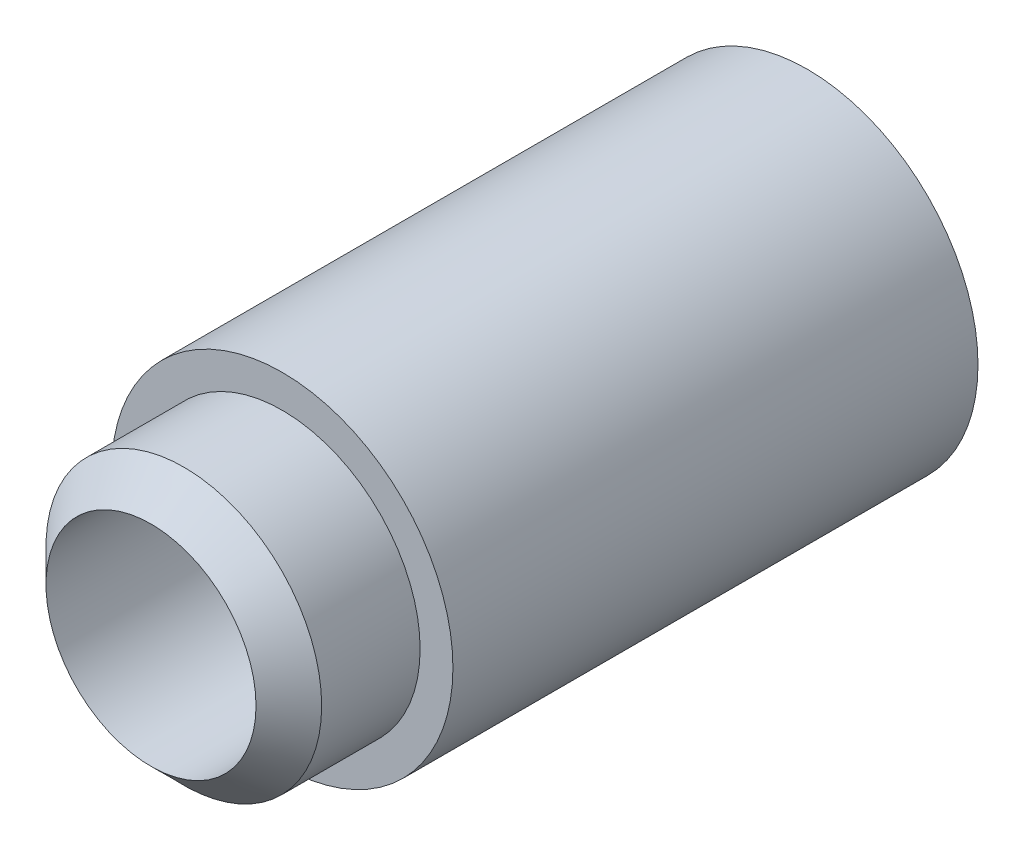
ISO-10303-21;
HEADER;
FILE_DESCRIPTION(('STEP AP214'),'2;1');
FILE_NAME('part.step','',(''),(''),'','','');
FILE_SCHEMA(('AUTOMOTIVE_DESIGN { 1 0 10303 214 1 1 1 1 }'));
ENDSEC;
DATA;
#1=APPLICATION_CONTEXT('core data for automotive mechanical design processes');
#2=APPLICATION_PROTOCOL_DEFINITION('international standard','automotive_design',2000,#1);
#3=PRODUCT_CONTEXT('',#1,'mechanical');
#4=PRODUCT('Part','Part','',(#3));
#5=PRODUCT_RELATED_PRODUCT_CATEGORY('part','',(#4));
#6=PRODUCT_DEFINITION_FORMATION('','',#4);
#7=PRODUCT_DEFINITION_CONTEXT('part definition',#1,'design');
#8=PRODUCT_DEFINITION('design','',#6,#7);
#9=PRODUCT_DEFINITION_SHAPE('','',#8);
#10=(LENGTH_UNIT() NAMED_UNIT(*) SI_UNIT(.MILLI.,.METRE.));
#11=(NAMED_UNIT(*) PLANE_ANGLE_UNIT() SI_UNIT($,.RADIAN.));
#12=(NAMED_UNIT(*) SI_UNIT($,.STERADIAN.) SOLID_ANGLE_UNIT());
#13=UNCERTAINTY_MEASURE_WITH_UNIT(LENGTH_MEASURE(1.E-05),#10,'distance_accuracy_value','');
#14=(GEOMETRIC_REPRESENTATION_CONTEXT(3) GLOBAL_UNCERTAINTY_ASSIGNED_CONTEXT((#13)) GLOBAL_UNIT_ASSIGNED_CONTEXT((#10,
#11,#12)) REPRESENTATION_CONTEXT('',''));
#15=CARTESIAN_POINT('',(0.,0.,0.));
#16=DIRECTION('',(0.,0.,1.));
#17=DIRECTION('',(1.,0.,0.));
#18=AXIS2_PLACEMENT_3D('',#15,#16,#17);
#19=CARTESIAN_POINT('',(0.,0.,80.));
#20=DIRECTION('',(0.,0.,-1.));
#21=DIRECTION('',(-1.,0.,0.));
#22=AXIS2_PLACEMENT_3D('',#19,#20,#21);
#23=CYLINDRICAL_SURFACE('',#22,21.);
#24=CARTESIAN_POINT('',(0.,0.,0.));
#25=DIRECTION('',(0.,0.,1.));
#26=DIRECTION('',(1.,0.,0.));
#27=AXIS2_PLACEMENT_3D('',#24,#25,#26);
#28=CIRCLE('',#27,21.);
#29=CARTESIAN_POINT('',(21.,0.,0.));
#30=VERTEX_POINT('',#29);
#31=EDGE_CURVE('E67',#30,#30,#28,.T.);
#32=ORIENTED_EDGE('',*,*,#31,.F.);
#33=EDGE_LOOP('',(#32));
#34=FACE_BOUND('',#33,.T.);
#35=CARTESIAN_POINT('',(0.,0.,70.));
#36=DIRECTION('',(0.,0.,1.));
#37=DIRECTION('',(1.,0.,0.));
#38=AXIS2_PLACEMENT_3D('',#35,#36,#37);
#39=CIRCLE('',#38,21.);
#40=CARTESIAN_POINT('',(21.,0.,70.));
#41=VERTEX_POINT('',#40);
#42=EDGE_CURVE('E71',#41,#41,#39,.T.);
#43=ORIENTED_EDGE('',*,*,#42,.T.);
#44=EDGE_LOOP('',(#43));
#45=FACE_BOUND('',#44,.T.);
#46=ADVANCED_FACE('F45',(#34,#45),#23,.F.);
#47=CARTESIAN_POINT('',(0.,0.,80.));
#48=DIRECTION('',(0.,0.,1.));
#49=DIRECTION('',(1.,0.,0.));
#50=AXIS2_PLACEMENT_3D('',#47,#48,#49);
#51=PLANE('',#50);
#52=CARTESIAN_POINT('',(0.,0.,80.));
#53=DIRECTION('',(0.,0.,1.));
#54=DIRECTION('',(1.,0.,0.));
#55=AXIS2_PLACEMENT_3D('',#52,#53,#54);
#56=CIRCLE('',#55,26.);
#57=CARTESIAN_POINT('',(26.,0.,80.));
#58=VERTEX_POINT('',#57);
#59=EDGE_CURVE('E54',#58,#58,#56,.T.);
#60=ORIENTED_EDGE('',*,*,#59,.T.);
#61=EDGE_LOOP('',(#60));
#62=FACE_BOUND('',#61,.T.);
#63=CARTESIAN_POINT('',(0.,0.,80.));
#64=DIRECTION('',(0.,0.,1.));
#65=DIRECTION('',(1.,0.,0.));
#66=AXIS2_PLACEMENT_3D('',#63,#64,#65);
#67=CIRCLE('',#66,21.);
#68=CARTESIAN_POINT('',(21.,0.,80.));
#69=VERTEX_POINT('',#68);
#70=EDGE_CURVE('E65',#69,#69,#67,.T.);
#71=ORIENTED_EDGE('',*,*,#70,.F.);
#72=EDGE_LOOP('',(#71));
#73=FACE_BOUND('',#72,.T.);
#74=ADVANCED_FACE('F99',(#62,#73),#51,.T.);
#75=CARTESIAN_POINT('',(0.,0.,0.));
#76=DIRECTION('',(0.,0.,1.));
#77=DIRECTION('',(1.,0.,0.));
#78=AXIS2_PLACEMENT_3D('',#75,#76,#77);
#79=PLANE('',#78);
#80=CARTESIAN_POINT('',(0.,0.,0.));
#81=DIRECTION('',(0.,0.,1.));
#82=DIRECTION('',(1.,0.,0.));
#83=AXIS2_PLACEMENT_3D('',#80,#81,#82);
#84=CIRCLE('',#83,26.);
#85=CARTESIAN_POINT('',(26.,0.,0.));
#86=VERTEX_POINT('',#85);
#87=EDGE_CURVE('E59',#86,#86,#84,.T.);
#88=ORIENTED_EDGE('',*,*,#87,.F.);
#89=EDGE_LOOP('',(#88));
#90=FACE_BOUND('',#89,.T.);
#91=ORIENTED_EDGE('',*,*,#31,.T.);
#92=EDGE_LOOP('',(#91));
#93=FACE_BOUND('',#92,.T.);
#94=ADVANCED_FACE('F107',(#90,#93),#79,.F.);
#95=CARTESIAN_POINT('',(0.,0.,80.));
#96=DIRECTION('',(0.,0.,-1.));
#97=DIRECTION('',(-1.,0.,0.));
#98=AXIS2_PLACEMENT_3D('',#95,#96,#97);
#99=CYLINDRICAL_SURFACE('',#98,26.);
#100=ORIENTED_EDGE('',*,*,#59,.F.);
#101=EDGE_LOOP('',(#100));
#102=FACE_BOUND('',#101,.T.);
#103=ORIENTED_EDGE('',*,*,#87,.T.);
#104=EDGE_LOOP('',(#103));
#105=FACE_BOUND('',#104,.T.);
#106=ADVANCED_FACE('F115',(#102,#105),#99,.T.);
#107=CARTESIAN_POINT('',(0.,0.,70.));
#108=DIRECTION('',(0.,0.,1.));
#109=DIRECTION('',(1.,0.,0.));
#110=AXIS2_PLACEMENT_3D('',#107,#108,#109);
#111=PLANE('',#110);
#112=ORIENTED_EDGE('',*,*,#42,.F.);
#113=EDGE_LOOP('',(#112));
#114=FACE_BOUND('',#113,.T.);
#115=CARTESIAN_POINT('',(0.,0.,70.));
#116=DIRECTION('',(0.,0.,1.));
#117=DIRECTION('',(1.,0.,0.));
#118=AXIS2_PLACEMENT_3D('',#115,#116,#117);
#119=CIRCLE('',#118,16.);
#120=CARTESIAN_POINT('',(16.,0.,70.));
#121=VERTEX_POINT('',#120);
#122=EDGE_CURVE('E79',#121,#121,#119,.T.);
#123=ORIENTED_EDGE('',*,*,#122,.T.);
#124=EDGE_LOOP('',(#123));
#125=FACE_BOUND('',#124,.T.);
#126=ADVANCED_FACE('F117',(#114,#125),#111,.F.);
#127=CARTESIAN_POINT('',(0.,0.,100.));
#128=DIRECTION('',(0.,0.,-1.));
#129=DIRECTION('',(-1.,0.,0.));
#130=AXIS2_PLACEMENT_3D('',#127,#128,#129);
#131=CYLINDRICAL_SURFACE('',#130,21.);
#132=CARTESIAN_POINT('',(0.,0.,95.));
#133=DIRECTION('',(0.,0.,1.));
#134=DIRECTION('',(1.,0.,0.));
#135=AXIS2_PLACEMENT_3D('',#132,#133,#134);
#136=CIRCLE('',#135,21.);
#137=CARTESIAN_POINT('',(21.,0.,95.));
#138=VERTEX_POINT('',#137);
#139=EDGE_CURVE('E10',#138,#138,#136,.F.);
#140=ORIENTED_EDGE('',*,*,#139,.T.);
#141=EDGE_LOOP('',(#140));
#142=FACE_BOUND('',#141,.T.);
#143=ORIENTED_EDGE('',*,*,#70,.T.);
#144=EDGE_LOOP('',(#143));
#145=FACE_BOUND('',#144,.T.);
#146=ADVANCED_FACE('F96',(#142,#145),#131,.T.);
#147=CARTESIAN_POINT('',(0.,0.,100.));
#148=DIRECTION('',(0.,0.,-1.));
#149=DIRECTION('',(-1.,0.,0.));
#150=AXIS2_PLACEMENT_3D('',#147,#148,#149);
#151=CYLINDRICAL_SURFACE('',#150,16.);
#152=CARTESIAN_POINT('',(0.,0.,100.));
#153=DIRECTION('',(0.,0.,1.));
#154=DIRECTION('',(1.,0.,0.));
#155=AXIS2_PLACEMENT_3D('',#152,#153,#154);
#156=CIRCLE('',#155,16.);
#157=CARTESIAN_POINT('',(16.,0.,100.));
#158=VERTEX_POINT('',#157);
#159=EDGE_CURVE('E78',#158,#158,#156,.T.);
#160=ORIENTED_EDGE('',*,*,#159,.T.);
#161=EDGE_LOOP('',(#160));
#162=FACE_BOUND('',#161,.T.);
#163=ORIENTED_EDGE('',*,*,#122,.F.);
#164=EDGE_LOOP('',(#163));
#165=FACE_BOUND('',#164,.T.);
#166=ADVANCED_FACE('F87',(#162,#165),#151,.F.);
#167=CARTESIAN_POINT('',(0.,0.,100.));
#168=DIRECTION('',(0.,0.,-1.));
#169=DIRECTION('',(-1.,0.,0.));
#170=AXIS2_PLACEMENT_3D('',#167,#168,#169);
#171=CONICAL_SURFACE('',#170,16.,0.785398163397447);
#172=ORIENTED_EDGE('',*,*,#139,.F.);
#173=EDGE_LOOP('',(#172));
#174=FACE_BOUND('',#173,.T.);
#175=ORIENTED_EDGE('',*,*,#159,.F.);
#176=EDGE_LOOP('',(#175));
#177=FACE_BOUND('',#176,.T.);
#178=ADVANCED_FACE('F48',(#174,#177),#171,.T.);
#179=CLOSED_SHELL('',(#46,#74,#94,#106,#126,#146,#166,#178));
#180=MANIFOLD_SOLID_BREP('B2',#179);
#181=ADVANCED_BREP_SHAPE_REPRESENTATION('',(#18,#180),#14);
#182=SHAPE_DEFINITION_REPRESENTATION(#9,#181);
ENDSEC;
END-ISO-10303-21;
